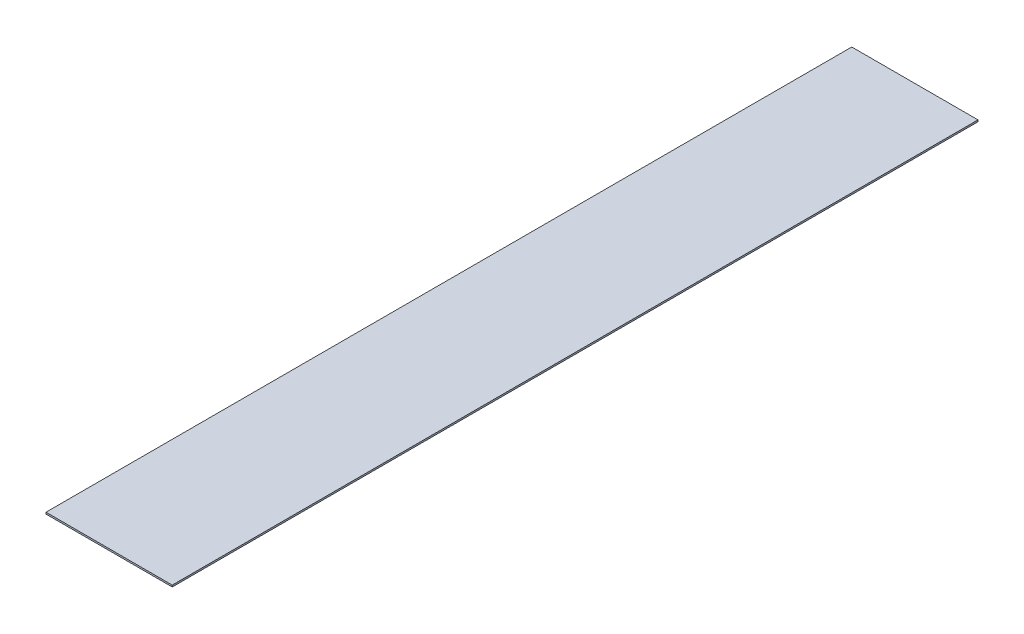
ISO-10303-21;
HEADER;
FILE_DESCRIPTION(('STEP AP214'),'2;1');
FILE_NAME('part.step','',(''),(''),'','','');
FILE_SCHEMA(('AUTOMOTIVE_DESIGN { 1 0 10303 214 1 1 1 1 }'));
ENDSEC;
DATA;
#1=APPLICATION_CONTEXT('core data for automotive mechanical design processes');
#2=APPLICATION_PROTOCOL_DEFINITION('international standard','automotive_design',2000,#1);
#3=PRODUCT_CONTEXT('',#1,'mechanical');
#4=PRODUCT('Part','Part','',(#3));
#5=PRODUCT_RELATED_PRODUCT_CATEGORY('part','',(#4));
#6=PRODUCT_DEFINITION_FORMATION('','',#4);
#7=PRODUCT_DEFINITION_CONTEXT('part definition',#1,'design');
#8=PRODUCT_DEFINITION('design','',#6,#7);
#9=PRODUCT_DEFINITION_SHAPE('','',#8);
#10=(LENGTH_UNIT() NAMED_UNIT(*) SI_UNIT(.MILLI.,.METRE.));
#11=(NAMED_UNIT(*) PLANE_ANGLE_UNIT() SI_UNIT($,.RADIAN.));
#12=(NAMED_UNIT(*) SI_UNIT($,.STERADIAN.) SOLID_ANGLE_UNIT());
#13=UNCERTAINTY_MEASURE_WITH_UNIT(LENGTH_MEASURE(1.E-05),#10,'distance_accuracy_value','');
#14=(GEOMETRIC_REPRESENTATION_CONTEXT(3) GLOBAL_UNCERTAINTY_ASSIGNED_CONTEXT((#13)) GLOBAL_UNIT_ASSIGNED_CONTEXT((#10,
#11,#12)) REPRESENTATION_CONTEXT('',''));
#15=CARTESIAN_POINT('',(0.,0.,0.));
#16=DIRECTION('',(0.,0.,1.));
#17=DIRECTION('',(1.,0.,0.));
#18=AXIS2_PLACEMENT_3D('',#15,#16,#17);
#19=CARTESIAN_POINT('',(1880.,50.,-12000.));
#20=DIRECTION('',(-1.,0.,0.));
#21=DIRECTION('',(0.,0.,1.));
#22=AXIS2_PLACEMENT_3D('',#19,#20,#21);
#23=PLANE('',#22);
#24=DIRECTION('',(0.,0.,-1.));
#25=VECTOR('',#24,1.);
#26=CARTESIAN_POINT('',(1880.,0.,-12000.));
#27=LINE('',#26,#25);
#28=CARTESIAN_POINT('',(1880.,0.,12000.));
#29=VERTEX_POINT('',#28);
#30=CARTESIAN_POINT('',(1880.,0.,-12000.));
#31=VERTEX_POINT('',#30);
#32=EDGE_CURVE('E101',#29,#31,#27,.T.);
#33=ORIENTED_EDGE('',*,*,#32,.T.);
#34=DIRECTION('',(0.,-1.,0.));
#35=VECTOR('',#34,1.);
#36=CARTESIAN_POINT('',(1880.,50.,-12000.));
#37=LINE('',#36,#35);
#38=CARTESIAN_POINT('',(1880.,50.,-12000.));
#39=VERTEX_POINT('',#38);
#40=EDGE_CURVE('E11',#39,#31,#37,.T.);
#41=ORIENTED_EDGE('',*,*,#40,.F.);
#42=DIRECTION('',(0.,0.,-1.));
#43=VECTOR('',#42,1.);
#44=CARTESIAN_POINT('',(1880.,50.,-12000.));
#45=LINE('',#44,#43);
#46=CARTESIAN_POINT('',(1880.,50.,12000.));
#47=VERTEX_POINT('',#46);
#48=EDGE_CURVE('E89',#47,#39,#45,.T.);
#49=ORIENTED_EDGE('',*,*,#48,.F.);
#50=DIRECTION('',(0.,-1.,0.));
#51=VECTOR('',#50,1.);
#52=CARTESIAN_POINT('',(1880.,50.,12000.));
#53=LINE('',#52,#51);
#54=EDGE_CURVE('E97',#47,#29,#53,.T.);
#55=ORIENTED_EDGE('',*,*,#54,.T.);
#56=EDGE_LOOP('',(#33,#41,#49,#55));
#57=FACE_BOUND('',#56,.T.);
#58=ADVANCED_FACE('F38',(#57),#23,.F.);
#59=CARTESIAN_POINT('',(-1880.,50.,-12000.));
#60=DIRECTION('',(0.,0.,1.));
#61=DIRECTION('',(1.,0.,0.));
#62=AXIS2_PLACEMENT_3D('',#59,#60,#61);
#63=PLANE('',#62);
#64=DIRECTION('',(-1.,0.,0.));
#65=VECTOR('',#64,1.);
#66=CARTESIAN_POINT('',(-1880.,0.,-12000.));
#67=LINE('',#66,#65);
#68=CARTESIAN_POINT('',(-1880.,0.,-12000.));
#69=VERTEX_POINT('',#68);
#70=EDGE_CURVE('E93',#31,#69,#67,.T.);
#71=ORIENTED_EDGE('',*,*,#70,.T.);
#72=DIRECTION('',(0.,-1.,0.));
#73=VECTOR('',#72,1.);
#74=CARTESIAN_POINT('',(-1880.,50.,-12000.));
#75=LINE('',#74,#73);
#76=CARTESIAN_POINT('',(-1880.,50.,-12000.));
#77=VERTEX_POINT('',#76);
#78=EDGE_CURVE('E46',#77,#69,#75,.T.);
#79=ORIENTED_EDGE('',*,*,#78,.F.);
#80=DIRECTION('',(-1.,0.,0.));
#81=VECTOR('',#80,1.);
#82=CARTESIAN_POINT('',(-1880.,50.,-12000.));
#83=LINE('',#82,#81);
#84=EDGE_CURVE('E84',#39,#77,#83,.T.);
#85=ORIENTED_EDGE('',*,*,#84,.F.);
#86=ORIENTED_EDGE('',*,*,#40,.T.);
#87=EDGE_LOOP('',(#71,#79,#85,#86));
#88=FACE_BOUND('',#87,.T.);
#89=ADVANCED_FACE('F92',(#88),#63,.F.);
#90=CARTESIAN_POINT('',(-1880.,50.,-12000.));
#91=DIRECTION('',(1.,0.,0.));
#92=DIRECTION('',(0.,0.,-1.));
#93=AXIS2_PLACEMENT_3D('',#90,#91,#92);
#94=PLANE('',#93);
#95=DIRECTION('',(0.,0.,1.));
#96=VECTOR('',#95,1.);
#97=CARTESIAN_POINT('',(-1880.,0.,-12000.));
#98=LINE('',#97,#96);
#99=CARTESIAN_POINT('',(-1880.,0.,12000.));
#100=VERTEX_POINT('',#99);
#101=EDGE_CURVE('E71',#69,#100,#98,.T.);
#102=ORIENTED_EDGE('',*,*,#101,.T.);
#103=DIRECTION('',(0.,-1.,0.));
#104=VECTOR('',#103,1.);
#105=CARTESIAN_POINT('',(-1880.,50.,12000.));
#106=LINE('',#105,#104);
#107=CARTESIAN_POINT('',(-1880.,50.,12000.));
#108=VERTEX_POINT('',#107);
#109=EDGE_CURVE('E94',#108,#100,#106,.T.);
#110=ORIENTED_EDGE('',*,*,#109,.F.);
#111=DIRECTION('',(0.,0.,1.));
#112=VECTOR('',#111,1.);
#113=CARTESIAN_POINT('',(-1880.,50.,-12000.));
#114=LINE('',#113,#112);
#115=EDGE_CURVE('E87',#77,#108,#114,.T.);
#116=ORIENTED_EDGE('',*,*,#115,.F.);
#117=ORIENTED_EDGE('',*,*,#78,.T.);
#118=EDGE_LOOP('',(#102,#110,#116,#117));
#119=FACE_BOUND('',#118,.T.);
#120=ADVANCED_FACE('F95',(#119),#94,.F.);
#121=CARTESIAN_POINT('',(-1880.,50.,12000.));
#122=DIRECTION('',(0.,0.,-1.));
#123=DIRECTION('',(-1.,0.,0.));
#124=AXIS2_PLACEMENT_3D('',#121,#122,#123);
#125=PLANE('',#124);
#126=DIRECTION('',(1.,0.,0.));
#127=VECTOR('',#126,1.);
#128=CARTESIAN_POINT('',(-1880.,0.,12000.));
#129=LINE('',#128,#127);
#130=EDGE_CURVE('E77',#100,#29,#129,.T.);
#131=ORIENTED_EDGE('',*,*,#130,.T.);
#132=ORIENTED_EDGE('',*,*,#54,.F.);
#133=DIRECTION('',(1.,0.,0.));
#134=VECTOR('',#133,1.);
#135=CARTESIAN_POINT('',(-1880.,50.,12000.));
#136=LINE('',#135,#134);
#137=EDGE_CURVE('E54',#108,#47,#136,.T.);
#138=ORIENTED_EDGE('',*,*,#137,.F.);
#139=ORIENTED_EDGE('',*,*,#109,.T.);
#140=EDGE_LOOP('',(#131,#132,#138,#139));
#141=FACE_BOUND('',#140,.T.);
#142=ADVANCED_FACE('F108',(#141),#125,.F.);
#143=CARTESIAN_POINT('',(1880.,50.,12000.));
#144=DIRECTION('',(0.,1.,0.));
#145=DIRECTION('',(0.,0.,1.));
#146=AXIS2_PLACEMENT_3D('',#143,#144,#145);
#147=PLANE('',#146);
#148=ORIENTED_EDGE('',*,*,#48,.T.);
#149=ORIENTED_EDGE('',*,*,#84,.T.);
#150=ORIENTED_EDGE('',*,*,#115,.T.);
#151=ORIENTED_EDGE('',*,*,#137,.T.);
#152=EDGE_LOOP('',(#148,#149,#150,#151));
#153=FACE_BOUND('',#152,.T.);
#154=ADVANCED_FACE('F85',(#153),#147,.T.);
#155=CARTESIAN_POINT('',(1880.,0.,12000.));
#156=DIRECTION('',(0.,1.,0.));
#157=DIRECTION('',(0.,0.,1.));
#158=AXIS2_PLACEMENT_3D('',#155,#156,#157);
#159=PLANE('',#158);
#160=ORIENTED_EDGE('',*,*,#32,.F.);
#161=ORIENTED_EDGE('',*,*,#130,.F.);
#162=ORIENTED_EDGE('',*,*,#101,.F.);
#163=ORIENTED_EDGE('',*,*,#70,.F.);
#164=EDGE_LOOP('',(#160,#161,#162,#163));
#165=FACE_BOUND('',#164,.T.);
#166=ADVANCED_FACE('F111',(#165),#159,.F.);
#167=CLOSED_SHELL('',(#58,#89,#120,#142,#154,#166));
#168=MANIFOLD_SOLID_BREP('B2',#167);
#169=ADVANCED_BREP_SHAPE_REPRESENTATION('',(#18,#168),#14);
#170=SHAPE_DEFINITION_REPRESENTATION(#9,#169);
ENDSEC;
END-ISO-10303-21;
